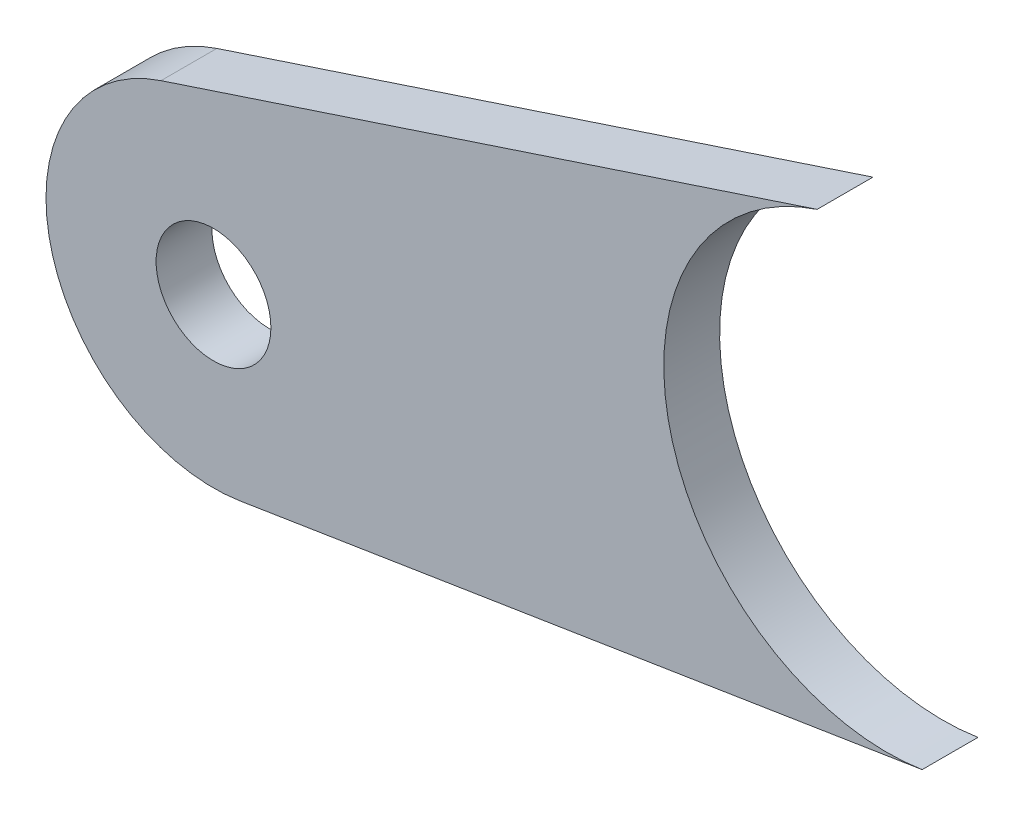
ISO-10303-21;
HEADER;
FILE_DESCRIPTION(('STEP AP214'),'2;1');
FILE_NAME('part.step','',(''),(''),'','','');
FILE_SCHEMA(('AUTOMOTIVE_DESIGN { 1 0 10303 214 1 1 1 1 }'));
ENDSEC;
DATA;
#1=APPLICATION_CONTEXT('core data for automotive mechanical design processes');
#2=APPLICATION_PROTOCOL_DEFINITION('international standard','automotive_design',2000,#1);
#3=PRODUCT_CONTEXT('',#1,'mechanical');
#4=PRODUCT('Part','Part','',(#3));
#5=PRODUCT_RELATED_PRODUCT_CATEGORY('part','',(#4));
#6=PRODUCT_DEFINITION_FORMATION('','',#4);
#7=PRODUCT_DEFINITION_CONTEXT('part definition',#1,'design');
#8=PRODUCT_DEFINITION('design','',#6,#7);
#9=PRODUCT_DEFINITION_SHAPE('','',#8);
#10=(LENGTH_UNIT() NAMED_UNIT(*) SI_UNIT(.MILLI.,.METRE.));
#11=(NAMED_UNIT(*) PLANE_ANGLE_UNIT() SI_UNIT($,.RADIAN.));
#12=(NAMED_UNIT(*) SI_UNIT($,.STERADIAN.) SOLID_ANGLE_UNIT());
#13=UNCERTAINTY_MEASURE_WITH_UNIT(LENGTH_MEASURE(1.E-05),#10,'distance_accuracy_value','');
#14=(GEOMETRIC_REPRESENTATION_CONTEXT(3) GLOBAL_UNCERTAINTY_ASSIGNED_CONTEXT((#13)) GLOBAL_UNIT_ASSIGNED_CONTEXT((#10,
#11,#12)) REPRESENTATION_CONTEXT('',''));
#15=CARTESIAN_POINT('',(0.,0.,0.));
#16=DIRECTION('',(0.,0.,1.));
#17=DIRECTION('',(1.,0.,0.));
#18=AXIS2_PLACEMENT_3D('',#15,#16,#17);
#19=CARTESIAN_POINT('',(139.868883953142,9.30044216380069,3.175));
#20=DIRECTION('',(0.,0.,-1.));
#21=DIRECTION('',(-1.,0.,0.));
#22=AXIS2_PLACEMENT_3D('',#19,#20,#21);
#23=CYLINDRICAL_SURFACE('',#22,12.7);
#24=CARTESIAN_POINT('',(139.868883953142,9.30044216380069,0.));
#25=DIRECTION('',(0.,0.,1.));
#26=DIRECTION('',(1.,0.,0.));
#27=AXIS2_PLACEMENT_3D('',#24,#25,#26);
#28=CIRCLE('',#27,12.7);
#29=CARTESIAN_POINT('',(135.888002746826,21.3604000750537,0.));
#30=VERTEX_POINT('',#29);
#31=CARTESIAN_POINT('',(141.861604691021,-3.24224750232871,0.));
#32=VERTEX_POINT('',#31);
#33=EDGE_CURVE('E108',#30,#32,#28,.T.);
#34=ORIENTED_EDGE('',*,*,#33,.F.);
#35=DIRECTION('',(0.,0.,-1.));
#36=VECTOR('',#35,1.);
#37=CARTESIAN_POINT('',(135.888002746826,21.3604000750537,3.175));
#38=LINE('',#37,#36);
#39=CARTESIAN_POINT('',(135.888002746826,21.3604000750537,3.175));
#40=VERTEX_POINT('',#39);
#41=EDGE_CURVE('E11',#40,#30,#38,.T.);
#42=ORIENTED_EDGE('',*,*,#41,.F.);
#43=CARTESIAN_POINT('',(139.868883953142,9.30044216380069,3.175));
#44=DIRECTION('',(0.,0.,1.));
#45=DIRECTION('',(1.,0.,0.));
#46=AXIS2_PLACEMENT_3D('',#43,#44,#45);
#47=CIRCLE('',#46,12.7);
#48=CARTESIAN_POINT('',(141.861604691021,-3.24224750232871,3.175));
#49=VERTEX_POINT('',#48);
#50=EDGE_CURVE('E99',#40,#49,#47,.T.);
#51=ORIENTED_EDGE('',*,*,#50,.T.);
#52=DIRECTION('',(0.,0.,-1.));
#53=VECTOR('',#52,1.);
#54=CARTESIAN_POINT('',(141.861604691021,-3.24224750232871,3.175));
#55=LINE('',#54,#53);
#56=EDGE_CURVE('E79',#49,#32,#55,.T.);
#57=ORIENTED_EDGE('',*,*,#56,.T.);
#58=EDGE_LOOP('',(#34,#42,#51,#57));
#59=FACE_BOUND('',#58,.T.);
#60=ADVANCED_FACE('F41',(#59),#23,.F.);
#61=CARTESIAN_POINT('',(6.99346891163585,-21.1865002638502,3.175));
#62=DIRECTION('',(-0.313455213095803,0.949602985138034,0.));
#63=DIRECTION('',(-0.949602985138034,-0.313455213095803,0.));
#64=AXIS2_PLACEMENT_3D('',#61,#62,#63);
#65=PLANE('',#64);
#66=DIRECTION('',(0.949602985138034,0.313455213095803,0.));
#67=VECTOR('',#66,1.);
#68=CARTESIAN_POINT('',(6.99346891163585,-21.1865002638502,0.));
#69=LINE('',#68,#67);
#70=CARTESIAN_POINT('',(98.5787790952624,9.0449684334399,0.));
#71=VERTEX_POINT('',#70);
#72=EDGE_CURVE('E92',#71,#30,#69,.T.);
#73=ORIENTED_EDGE('',*,*,#72,.F.);
#74=DIRECTION('',(0.,0.,-1.));
#75=VECTOR('',#74,1.);
#76=CARTESIAN_POINT('',(98.5787790952624,9.0449684334399,3.175));
#77=LINE('',#76,#75);
#78=CARTESIAN_POINT('',(98.5787790952624,9.0449684334399,3.175));
#79=VERTEX_POINT('',#78);
#80=EDGE_CURVE('E49',#79,#71,#77,.T.);
#81=ORIENTED_EDGE('',*,*,#80,.F.);
#82=DIRECTION('',(0.949602985138034,0.313455213095803,0.));
#83=VECTOR('',#82,1.);
#84=CARTESIAN_POINT('',(6.99346891163585,-21.1865002638502,3.175));
#85=LINE('',#84,#83);
#86=EDGE_CURVE('E90',#79,#40,#85,.T.);
#87=ORIENTED_EDGE('',*,*,#86,.T.);
#88=ORIENTED_EDGE('',*,*,#41,.T.);
#89=EDGE_LOOP('',(#73,#81,#87,#88));
#90=FACE_BOUND('',#89,.T.);
#91=ADVANCED_FACE('F88',(#90),#65,.T.);
#92=CARTESIAN_POINT('',(101.56444,0.,3.175));
#93=DIRECTION('',(0.,0.,-1.));
#94=DIRECTION('',(-1.,0.,0.));
#95=AXIS2_PLACEMENT_3D('',#92,#93,#94);
#96=CYLINDRICAL_SURFACE('',#95,9.52500000000001);
#97=CARTESIAN_POINT('',(101.56444,0.,0.));
#98=DIRECTION('',(0.,0.,1.));
#99=DIRECTION('',(1.,0.,0.));
#100=AXIS2_PLACEMENT_3D('',#97,#98,#99);
#101=CIRCLE('',#100,9.52500000000001);
#102=CARTESIAN_POINT('',(103.058980553409,-9.40701724959692,0.));
#103=VERTEX_POINT('',#102);
#104=EDGE_CURVE('E72',#71,#103,#101,.T.);
#105=ORIENTED_EDGE('',*,*,#104,.T.);
#106=DIRECTION('',(0.,0.,-1.));
#107=VECTOR('',#106,1.);
#108=CARTESIAN_POINT('',(103.058980553409,-9.40701724959692,3.175));
#109=LINE('',#108,#107);
#110=CARTESIAN_POINT('',(103.058980553409,-9.40701724959692,3.175));
#111=VERTEX_POINT('',#110);
#112=EDGE_CURVE('E93',#111,#103,#109,.T.);
#113=ORIENTED_EDGE('',*,*,#112,.F.);
#114=CARTESIAN_POINT('',(101.56444,0.,3.175));
#115=DIRECTION('',(0.,0.,1.));
#116=DIRECTION('',(1.,0.,0.));
#117=AXIS2_PLACEMENT_3D('',#114,#115,#116);
#118=CIRCLE('',#117,9.52500000000001);
#119=EDGE_CURVE('E94',#79,#111,#118,.T.);
#120=ORIENTED_EDGE('',*,*,#119,.F.);
#121=ORIENTED_EDGE('',*,*,#80,.T.);
#122=EDGE_LOOP('',(#105,#113,#120,#121));
#123=FACE_BOUND('',#122,.T.);
#124=ADVANCED_FACE('F95',(#123),#96,.T.);
#125=CARTESIAN_POINT('',(3.9950420410262,-25.1458077247078,3.175));
#126=DIRECTION('',(-0.156907144714846,0.987613359537747,0.));
#127=DIRECTION('',(-0.987613359537747,-0.156907144714846,0.));
#128=AXIS2_PLACEMENT_3D('',#125,#126,#127);
#129=PLANE('',#128);
#130=DIRECTION('',(0.987613359537747,0.156907144714846,0.));
#131=VECTOR('',#130,1.);
#132=CARTESIAN_POINT('',(3.9950420410262,-25.1458077247078,0.));
#133=LINE('',#132,#131);
#134=EDGE_CURVE('E113',#103,#32,#133,.T.);
#135=ORIENTED_EDGE('',*,*,#134,.T.);
#136=ORIENTED_EDGE('',*,*,#56,.F.);
#137=DIRECTION('',(0.987613359537747,0.156907144714846,0.));
#138=VECTOR('',#137,1.);
#139=CARTESIAN_POINT('',(3.9950420410262,-25.1458077247078,3.175));
#140=LINE('',#139,#138);
#141=EDGE_CURVE('E57',#111,#49,#140,.T.);
#142=ORIENTED_EDGE('',*,*,#141,.F.);
#143=ORIENTED_EDGE('',*,*,#112,.T.);
#144=EDGE_LOOP('',(#135,#136,#142,#143));
#145=FACE_BOUND('',#144,.T.);
#146=ADVANCED_FACE('F120',(#145),#129,.F.);
#147=CARTESIAN_POINT('',(101.56444,0.,3.175));
#148=DIRECTION('',(0.,0.,-1.));
#149=DIRECTION('',(-1.,0.,0.));
#150=AXIS2_PLACEMENT_3D('',#147,#148,#149);
#151=CYLINDRICAL_SURFACE('',#150,3.26389999999999);
#152=CARTESIAN_POINT('',(101.56444,0.,3.175));
#153=DIRECTION('',(0.,0.,1.));
#154=DIRECTION('',(1.,0.,0.));
#155=AXIS2_PLACEMENT_3D('',#152,#153,#154);
#156=CIRCLE('',#155,3.26389999999999);
#157=CARTESIAN_POINT('',(104.82834,0.,3.175));
#158=VERTEX_POINT('',#157);
#159=EDGE_CURVE('E105',#158,#158,#156,.T.);
#160=ORIENTED_EDGE('',*,*,#159,.T.);
#161=EDGE_LOOP('',(#160));
#162=FACE_BOUND('',#161,.T.);
#163=CARTESIAN_POINT('',(101.56444,0.,0.));
#164=DIRECTION('',(0.,0.,1.));
#165=DIRECTION('',(1.,0.,0.));
#166=AXIS2_PLACEMENT_3D('',#163,#164,#165);
#167=CIRCLE('',#166,3.26389999999999);
#168=CARTESIAN_POINT('',(104.82834,0.,0.));
#169=VERTEX_POINT('',#168);
#170=EDGE_CURVE('E101',#169,#169,#167,.T.);
#171=ORIENTED_EDGE('',*,*,#170,.F.);
#172=EDGE_LOOP('',(#171));
#173=FACE_BOUND('',#172,.T.);
#174=ADVANCED_FACE('F135',(#162,#173),#151,.F.);
#175=CARTESIAN_POINT('',(0.,0.,3.175));
#176=DIRECTION('',(0.,0.,1.));
#177=DIRECTION('',(1.,0.,0.));
#178=AXIS2_PLACEMENT_3D('',#175,#176,#177);
#179=PLANE('',#178);
#180=ORIENTED_EDGE('',*,*,#50,.F.);
#181=ORIENTED_EDGE('',*,*,#86,.F.);
#182=ORIENTED_EDGE('',*,*,#119,.T.);
#183=ORIENTED_EDGE('',*,*,#141,.T.);
#184=EDGE_LOOP('',(#180,#181,#182,#183));
#185=FACE_BOUND('',#184,.T.);
#186=ORIENTED_EDGE('',*,*,#159,.F.);
#187=EDGE_LOOP('',(#186));
#188=FACE_BOUND('',#187,.T.);
#189=ADVANCED_FACE('F97',(#185,#188),#179,.T.);
#190=CARTESIAN_POINT('',(0.,0.,0.));
#191=DIRECTION('',(0.,0.,1.));
#192=DIRECTION('',(1.,0.,0.));
#193=AXIS2_PLACEMENT_3D('',#190,#191,#192);
#194=PLANE('',#193);
#195=ORIENTED_EDGE('',*,*,#33,.T.);
#196=ORIENTED_EDGE('',*,*,#134,.F.);
#197=ORIENTED_EDGE('',*,*,#104,.F.);
#198=ORIENTED_EDGE('',*,*,#72,.T.);
#199=EDGE_LOOP('',(#195,#196,#197,#198));
#200=FACE_BOUND('',#199,.T.);
#201=ORIENTED_EDGE('',*,*,#170,.T.);
#202=EDGE_LOOP('',(#201));
#203=FACE_BOUND('',#202,.T.);
#204=ADVANCED_FACE('F122',(#200,#203),#194,.F.);
#205=CLOSED_SHELL('',(#60,#91,#124,#146,#174,#189,#204));
#206=MANIFOLD_SOLID_BREP('B2',#205);
#207=ADVANCED_BREP_SHAPE_REPRESENTATION('',(#18,#206),#14);
#208=SHAPE_DEFINITION_REPRESENTATION(#9,#207);
ENDSEC;
END-ISO-10303-21;
